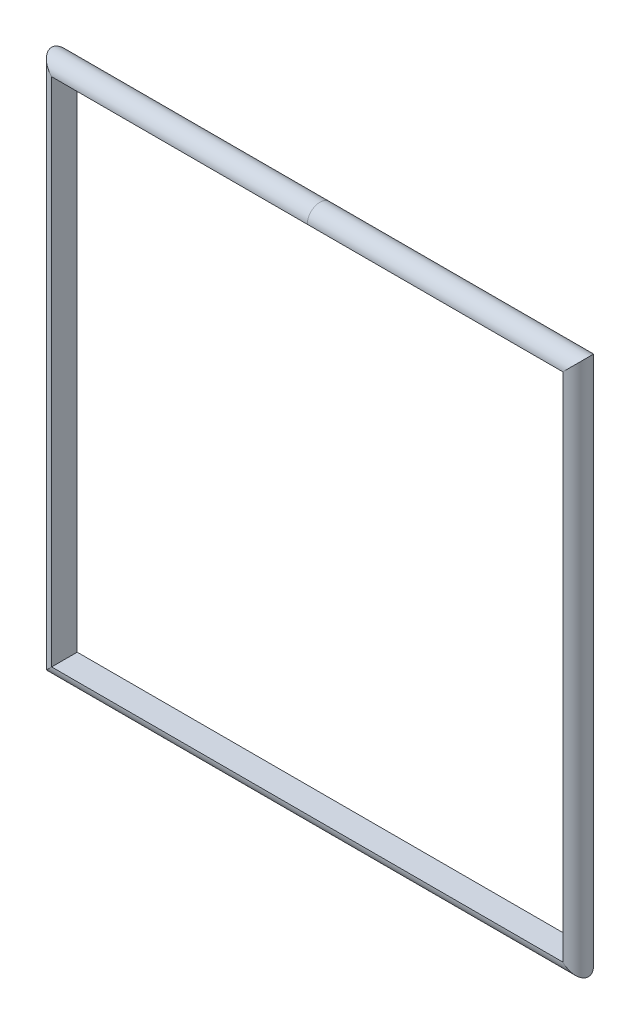
ISO-10303-21;
HEADER;
FILE_DESCRIPTION(('STEP AP214'),'2;1');
FILE_NAME('part.step','',(''),(''),'','','');
FILE_SCHEMA(('AUTOMOTIVE_DESIGN { 1 0 10303 214 1 1 1 1 }'));
ENDSEC;
DATA;
#1=APPLICATION_CONTEXT('core data for automotive mechanical design processes');
#2=APPLICATION_PROTOCOL_DEFINITION('international standard','automotive_design',2000,#1);
#3=PRODUCT_CONTEXT('',#1,'mechanical');
#4=PRODUCT('Part','Part','',(#3));
#5=PRODUCT_RELATED_PRODUCT_CATEGORY('part','',(#4));
#6=PRODUCT_DEFINITION_FORMATION('','',#4);
#7=PRODUCT_DEFINITION_CONTEXT('part definition',#1,'design');
#8=PRODUCT_DEFINITION('design','',#6,#7);
#9=PRODUCT_DEFINITION_SHAPE('','',#8);
#10=(LENGTH_UNIT() NAMED_UNIT(*) SI_UNIT(.MILLI.,.METRE.));
#11=(NAMED_UNIT(*) PLANE_ANGLE_UNIT() SI_UNIT($,.RADIAN.));
#12=(NAMED_UNIT(*) SI_UNIT($,.STERADIAN.) SOLID_ANGLE_UNIT());
#13=UNCERTAINTY_MEASURE_WITH_UNIT(LENGTH_MEASURE(1.E-05),#10,'distance_accuracy_value','');
#14=(GEOMETRIC_REPRESENTATION_CONTEXT(3) GLOBAL_UNCERTAINTY_ASSIGNED_CONTEXT((#13)) GLOBAL_UNIT_ASSIGNED_CONTEXT((#10,
#11,#12)) REPRESENTATION_CONTEXT('',''));
#15=CARTESIAN_POINT('',(0.,0.,0.));
#16=DIRECTION('',(0.,0.,1.));
#17=DIRECTION('',(1.,0.,0.));
#18=AXIS2_PLACEMENT_3D('',#15,#16,#17);
#19=CARTESIAN_POINT('',(-0.3,-0.5,0.015));
#20=DIRECTION('',(1.,0.,0.));
#21=DIRECTION('',(0.,0.,-1.));
#22=AXIS2_PLACEMENT_3D('',#19,#20,#21);
#23=PLANE('',#22);
#24=DIRECTION('',(0.,1.,0.));
#25=VECTOR('',#24,1.);
#26=CARTESIAN_POINT('',(-0.3,-0.5,-0.015));
#27=LINE('',#26,#25);
#28=CARTESIAN_POINT('',(-0.3,-0.3,-0.015));
#29=VERTEX_POINT('',#28);
#30=CARTESIAN_POINT('',(-0.3,0.3,-0.015));
#31=VERTEX_POINT('',#30);
#32=EDGE_CURVE('E36',#29,#31,#27,.T.);
#33=ORIENTED_EDGE('',*,*,#32,.T.);
#34=DIRECTION('',(0.,0.,1.));
#35=VECTOR('',#34,1.);
#36=CARTESIAN_POINT('',(-0.3,0.3,0.015));
#37=LINE('',#36,#35);
#38=CARTESIAN_POINT('',(-0.3,0.3,0.015));
#39=VERTEX_POINT('',#38);
#40=EDGE_CURVE('E81',#31,#39,#37,.T.);
#41=ORIENTED_EDGE('',*,*,#40,.T.);
#42=DIRECTION('',(0.,1.,0.));
#43=VECTOR('',#42,1.);
#44=CARTESIAN_POINT('',(-0.3,-0.5,0.015));
#45=LINE('',#44,#43);
#46=CARTESIAN_POINT('',(-0.3,-0.3,0.015));
#47=VERTEX_POINT('',#46);
#48=EDGE_CURVE('E83',#47,#39,#45,.T.);
#49=ORIENTED_EDGE('',*,*,#48,.F.);
#50=DIRECTION('',(0.,0.,1.));
#51=VECTOR('',#50,1.);
#52=CARTESIAN_POINT('',(-0.3,-0.3,0.015));
#53=LINE('',#52,#51);
#54=EDGE_CURVE('E93',#29,#47,#53,.T.);
#55=ORIENTED_EDGE('',*,*,#54,.F.);
#56=EDGE_LOOP('',(#33,#41,#49,#55));
#57=FACE_BOUND('',#56,.T.);
#58=ADVANCED_FACE('F33',(#57),#23,.T.);
#59=CARTESIAN_POINT('',(-0.3,-0.5,0.));
#60=DIRECTION('',(0.,1.,0.));
#61=DIRECTION('',(0.,0.,1.));
#62=AXIS2_PLACEMENT_3D('',#59,#60,#61);
#63=CYLINDRICAL_SURFACE('',#62,0.015);
#64=ORIENTED_EDGE('',*,*,#48,.T.);
#65=CARTESIAN_POINT('',(-0.3,0.3,0.));
#66=DIRECTION('',(0.707106781186547,0.707106781186547,0.));
#67=DIRECTION('',(0.707106781186548,-0.707106781186548,0.));
#68=AXIS2_PLACEMENT_3D('',#65,#66,#67);
#69=ELLIPSE('',#68,0.0212132034355964,0.015);
#70=EDGE_CURVE('E75',#39,#31,#69,.F.);
#71=ORIENTED_EDGE('',*,*,#70,.T.);
#72=ORIENTED_EDGE('',*,*,#32,.F.);
#73=CARTESIAN_POINT('',(-0.3,-0.3,0.));
#74=DIRECTION('',(-0.707106781186548,0.707106781186548,0.));
#75=DIRECTION('',(-0.707106781186548,-0.707106781186548,0.));
#76=AXIS2_PLACEMENT_3D('',#73,#74,#75);
#77=ELLIPSE('',#76,0.0212132034355964,0.015);
#78=EDGE_CURVE('E92',#47,#29,#77,.F.);
#79=ORIENTED_EDGE('',*,*,#78,.F.);
#80=EDGE_LOOP('',(#64,#71,#72,#79));
#81=FACE_BOUND('',#80,.T.);
#82=ADVANCED_FACE('F90',(#81),#63,.T.);
#83=CARTESIAN_POINT('',(-0.5,0.3,0.));
#84=DIRECTION('',(1.,0.,0.));
#85=DIRECTION('',(0.,0.,-1.));
#86=AXIS2_PLACEMENT_3D('',#83,#84,#85);
#87=CYLINDRICAL_SURFACE('',#86,0.015);
#88=ORIENTED_EDGE('',*,*,#70,.F.);
#89=DIRECTION('',(1.,0.,0.));
#90=VECTOR('',#89,1.);
#91=CARTESIAN_POINT('',(-0.5,0.3,0.015));
#92=LINE('',#91,#90);
#93=CARTESIAN_POINT('',(0.,0.3,0.015));
#94=VERTEX_POINT('',#93);
#95=EDGE_CURVE('E97',#39,#94,#92,.T.);
#96=ORIENTED_EDGE('',*,*,#95,.T.);
#97=CARTESIAN_POINT('',(0.,0.3,0.));
#98=DIRECTION('',(1.,0.,0.));
#99=DIRECTION('',(0.,0.,-1.));
#100=AXIS2_PLACEMENT_3D('',#97,#98,#99);
#101=CIRCLE('',#100,0.015);
#102=CARTESIAN_POINT('',(0.,0.3,-0.015));
#103=VERTEX_POINT('',#102);
#104=EDGE_CURVE('E107',#103,#94,#101,.T.);
#105=ORIENTED_EDGE('',*,*,#104,.F.);
#106=DIRECTION('',(1.,0.,0.));
#107=VECTOR('',#106,1.);
#108=CARTESIAN_POINT('',(-0.5,0.3,-0.015));
#109=LINE('',#108,#107);
#110=EDGE_CURVE('E99',#31,#103,#109,.T.);
#111=ORIENTED_EDGE('',*,*,#110,.F.);
#112=EDGE_LOOP('',(#88,#96,#105,#111));
#113=FACE_BOUND('',#112,.T.);
#114=ADVANCED_FACE('F95',(#113),#87,.T.);
#115=CARTESIAN_POINT('',(-0.5,0.3,0.015));
#116=DIRECTION('',(0.,-1.,0.));
#117=DIRECTION('',(0.,0.,-1.));
#118=AXIS2_PLACEMENT_3D('',#115,#116,#117);
#119=PLANE('',#118);
#120=ORIENTED_EDGE('',*,*,#40,.F.);
#121=ORIENTED_EDGE('',*,*,#110,.T.);
#122=DIRECTION('',(0.,0.,-1.));
#123=VECTOR('',#122,1.);
#124=CARTESIAN_POINT('',(0.,0.3,0.015));
#125=LINE('',#124,#123);
#126=EDGE_CURVE('E105',#94,#103,#125,.T.);
#127=ORIENTED_EDGE('',*,*,#126,.F.);
#128=ORIENTED_EDGE('',*,*,#95,.F.);
#129=EDGE_LOOP('',(#120,#121,#127,#128));
#130=FACE_BOUND('',#129,.T.);
#131=ADVANCED_FACE('F103',(#130),#119,.T.);
#132=CARTESIAN_POINT('',(0.,0.3,0.));
#133=DIRECTION('',(1.,0.,0.));
#134=DIRECTION('',(0.,0.,-1.));
#135=AXIS2_PLACEMENT_3D('',#132,#133,#134);
#136=CYLINDRICAL_SURFACE('',#135,0.015);
#137=DIRECTION('',(1.,0.,0.));
#138=VECTOR('',#137,1.);
#139=CARTESIAN_POINT('',(0.,0.3,0.015));
#140=LINE('',#139,#138);
#141=CARTESIAN_POINT('',(0.3,0.3,0.015));
#142=VERTEX_POINT('',#141);
#143=EDGE_CURVE('E87',#94,#142,#140,.T.);
#144=ORIENTED_EDGE('',*,*,#143,.T.);
#145=CARTESIAN_POINT('',(0.3,0.3,0.));
#146=DIRECTION('',(0.707106781186547,-0.707106781186547,0.));
#147=DIRECTION('',(-0.707106781186548,-0.707106781186548,0.));
#148=AXIS2_PLACEMENT_3D('',#145,#146,#147);
#149=ELLIPSE('',#148,0.0212132034355964,0.015);
#150=CARTESIAN_POINT('',(0.3,0.3,-0.015));
#151=VERTEX_POINT('',#150);
#152=EDGE_CURVE('E127',#142,#151,#149,.F.);
#153=ORIENTED_EDGE('',*,*,#152,.T.);
#154=DIRECTION('',(1.,0.,0.));
#155=VECTOR('',#154,1.);
#156=CARTESIAN_POINT('',(0.,0.3,-0.015));
#157=LINE('',#156,#155);
#158=EDGE_CURVE('E114',#103,#151,#157,.T.);
#159=ORIENTED_EDGE('',*,*,#158,.F.);
#160=ORIENTED_EDGE('',*,*,#104,.T.);
#161=EDGE_LOOP('',(#144,#153,#159,#160));
#162=FACE_BOUND('',#161,.T.);
#163=ADVANCED_FACE('F151',(#162),#136,.T.);
#164=CARTESIAN_POINT('',(0.,0.3,0.015));
#165=DIRECTION('',(0.,-1.,0.));
#166=DIRECTION('',(0.,0.,-1.));
#167=AXIS2_PLACEMENT_3D('',#164,#165,#166);
#168=PLANE('',#167);
#169=ORIENTED_EDGE('',*,*,#158,.T.);
#170=DIRECTION('',(0.,0.,1.));
#171=VECTOR('',#170,1.);
#172=CARTESIAN_POINT('',(0.3,0.3,0.015));
#173=LINE('',#172,#171);
#174=EDGE_CURVE('E125',#151,#142,#173,.T.);
#175=ORIENTED_EDGE('',*,*,#174,.T.);
#176=ORIENTED_EDGE('',*,*,#143,.F.);
#177=ORIENTED_EDGE('',*,*,#126,.T.);
#178=EDGE_LOOP('',(#169,#175,#176,#177));
#179=FACE_BOUND('',#178,.T.);
#180=ADVANCED_FACE('F148',(#179),#168,.T.);
#181=CARTESIAN_POINT('',(0.5,-0.3,0.015));
#182=DIRECTION('',(0.,1.,0.));
#183=DIRECTION('',(0.,0.,1.));
#184=AXIS2_PLACEMENT_3D('',#181,#182,#183);
#185=PLANE('',#184);
#186=DIRECTION('',(-1.,0.,0.));
#187=VECTOR('',#186,1.);
#188=CARTESIAN_POINT('',(0.5,-0.3,-0.015));
#189=LINE('',#188,#187);
#190=CARTESIAN_POINT('',(0.3,-0.3,-0.015));
#191=VERTEX_POINT('',#190);
#192=EDGE_CURVE('E123',#191,#29,#189,.T.);
#193=ORIENTED_EDGE('',*,*,#192,.T.);
#194=ORIENTED_EDGE('',*,*,#54,.T.);
#195=DIRECTION('',(-1.,0.,0.));
#196=VECTOR('',#195,1.);
#197=CARTESIAN_POINT('',(0.5,-0.3,0.015));
#198=LINE('',#197,#196);
#199=CARTESIAN_POINT('',(0.3,-0.3,0.015));
#200=VERTEX_POINT('',#199);
#201=EDGE_CURVE('E100',#200,#47,#198,.T.);
#202=ORIENTED_EDGE('',*,*,#201,.F.);
#203=DIRECTION('',(0.,0.,1.));
#204=VECTOR('',#203,1.);
#205=CARTESIAN_POINT('',(0.3,-0.3,0.015));
#206=LINE('',#205,#204);
#207=EDGE_CURVE('E136',#191,#200,#206,.T.);
#208=ORIENTED_EDGE('',*,*,#207,.F.);
#209=EDGE_LOOP('',(#193,#194,#202,#208));
#210=FACE_BOUND('',#209,.T.);
#211=ADVANCED_FACE('F121',(#210),#185,.T.);
#212=CARTESIAN_POINT('',(0.5,-0.3,0.));
#213=DIRECTION('',(-1.,0.,0.));
#214=DIRECTION('',(0.,0.,1.));
#215=AXIS2_PLACEMENT_3D('',#212,#213,#214);
#216=CYLINDRICAL_SURFACE('',#215,0.015);
#217=ORIENTED_EDGE('',*,*,#201,.T.);
#218=ORIENTED_EDGE('',*,*,#78,.T.);
#219=ORIENTED_EDGE('',*,*,#192,.F.);
#220=CARTESIAN_POINT('',(0.3,-0.3,0.));
#221=DIRECTION('',(-0.707106781186547,-0.707106781186547,0.));
#222=DIRECTION('',(0.707106781186548,-0.707106781186548,0.));
#223=AXIS2_PLACEMENT_3D('',#220,#221,#222);
#224=ELLIPSE('',#223,0.0212132034355964,0.015);
#225=EDGE_CURVE('E51',#200,#191,#224,.F.);
#226=ORIENTED_EDGE('',*,*,#225,.F.);
#227=EDGE_LOOP('',(#217,#218,#219,#226));
#228=FACE_BOUND('',#227,.T.);
#229=ADVANCED_FACE('F124',(#228),#216,.T.);
#230=CARTESIAN_POINT('',(0.3,0.5,0.015));
#231=DIRECTION('',(-1.,0.,0.));
#232=DIRECTION('',(0.,0.,1.));
#233=AXIS2_PLACEMENT_3D('',#230,#231,#232);
#234=PLANE('',#233);
#235=ORIENTED_EDGE('',*,*,#174,.F.);
#236=DIRECTION('',(0.,-1.,0.));
#237=VECTOR('',#236,1.);
#238=CARTESIAN_POINT('',(0.3,0.5,-0.015));
#239=LINE('',#238,#237);
#240=EDGE_CURVE('E11',#151,#191,#239,.T.);
#241=ORIENTED_EDGE('',*,*,#240,.T.);
#242=ORIENTED_EDGE('',*,*,#207,.T.);
#243=DIRECTION('',(0.,-1.,0.));
#244=VECTOR('',#243,1.);
#245=CARTESIAN_POINT('',(0.3,0.5,0.015));
#246=LINE('',#245,#244);
#247=EDGE_CURVE('E42',#142,#200,#246,.T.);
#248=ORIENTED_EDGE('',*,*,#247,.F.);
#249=EDGE_LOOP('',(#235,#241,#242,#248));
#250=FACE_BOUND('',#249,.T.);
#251=ADVANCED_FACE('F145',(#250),#234,.T.);
#252=CARTESIAN_POINT('',(0.3,0.5,0.));
#253=DIRECTION('',(0.,-1.,0.));
#254=DIRECTION('',(0.,0.,-1.));
#255=AXIS2_PLACEMENT_3D('',#252,#253,#254);
#256=CYLINDRICAL_SURFACE('',#255,0.015);
#257=ORIENTED_EDGE('',*,*,#152,.F.);
#258=ORIENTED_EDGE('',*,*,#247,.T.);
#259=ORIENTED_EDGE('',*,*,#225,.T.);
#260=ORIENTED_EDGE('',*,*,#240,.F.);
#261=EDGE_LOOP('',(#257,#258,#259,#260));
#262=FACE_BOUND('',#261,.T.);
#263=ADVANCED_FACE('F141',(#262),#256,.T.);
#264=CLOSED_SHELL('',(#58,#82,#114,#131,#163,#180,#211,#229,#251,#263));
#265=MANIFOLD_SOLID_BREP('B2',#264);
#266=ADVANCED_BREP_SHAPE_REPRESENTATION('',(#18,#265),#14);
#267=SHAPE_DEFINITION_REPRESENTATION(#9,#266);
ENDSEC;
END-ISO-10303-21;
